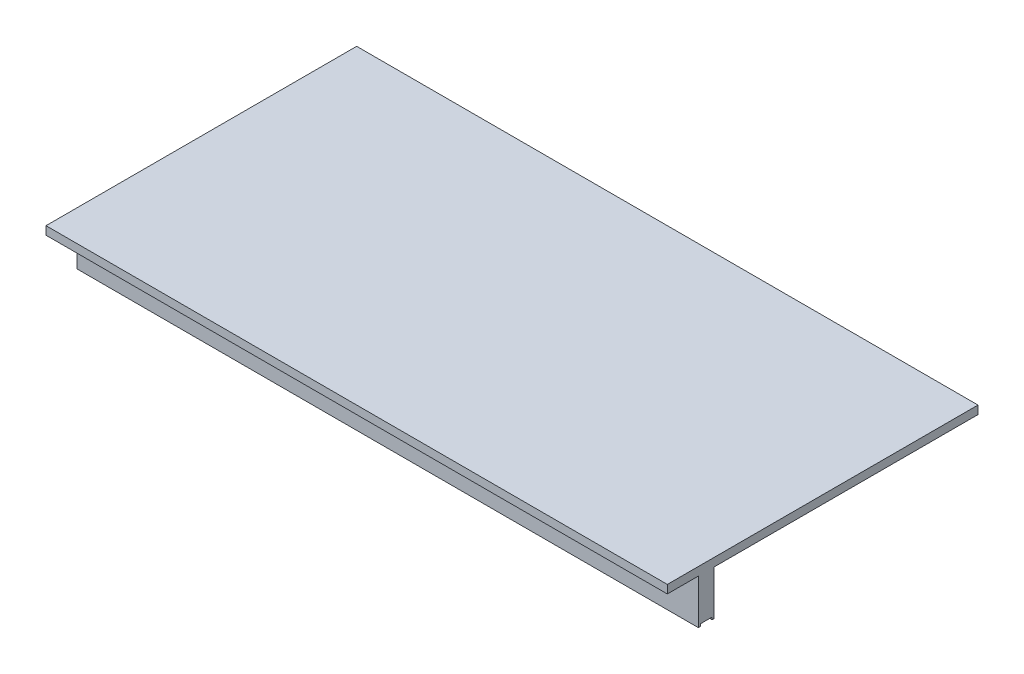
ISO-10303-21;
HEADER;
FILE_DESCRIPTION(('STEP AP214'),'2;1');
FILE_NAME('part.step','',(''),(''),'','','');
FILE_SCHEMA(('AUTOMOTIVE_DESIGN { 1 0 10303 214 1 1 1 1 }'));
ENDSEC;
DATA;
#1=APPLICATION_CONTEXT('core data for automotive mechanical design processes');
#2=APPLICATION_PROTOCOL_DEFINITION('international standard','automotive_design',2000,#1);
#3=PRODUCT_CONTEXT('',#1,'mechanical');
#4=PRODUCT('Part','Part','',(#3));
#5=PRODUCT_RELATED_PRODUCT_CATEGORY('part','',(#4));
#6=PRODUCT_DEFINITION_FORMATION('','',#4);
#7=PRODUCT_DEFINITION_CONTEXT('part definition',#1,'design');
#8=PRODUCT_DEFINITION('design','',#6,#7);
#9=PRODUCT_DEFINITION_SHAPE('','',#8);
#10=(LENGTH_UNIT() NAMED_UNIT(*) SI_UNIT(.MILLI.,.METRE.));
#11=(NAMED_UNIT(*) PLANE_ANGLE_UNIT() SI_UNIT($,.RADIAN.));
#12=(NAMED_UNIT(*) SI_UNIT($,.STERADIAN.) SOLID_ANGLE_UNIT());
#13=UNCERTAINTY_MEASURE_WITH_UNIT(LENGTH_MEASURE(1.E-05),#10,'distance_accuracy_value','');
#14=(GEOMETRIC_REPRESENTATION_CONTEXT(3) GLOBAL_UNCERTAINTY_ASSIGNED_CONTEXT((#13)) GLOBAL_UNIT_ASSIGNED_CONTEXT((#10,
#11,#12)) REPRESENTATION_CONTEXT('',''));
#15=CARTESIAN_POINT('',(0.,0.,0.));
#16=DIRECTION('',(0.,0.,1.));
#17=DIRECTION('',(1.,0.,0.));
#18=AXIS2_PLACEMENT_3D('',#15,#16,#17);
#19=CARTESIAN_POINT('',(1000.,-68.2290502793296,0.));
#20=DIRECTION('',(0.,1.,0.));
#21=DIRECTION('',(0.,0.,1.));
#22=AXIS2_PLACEMENT_3D('',#19,#20,#21);
#23=PLANE('',#22);
#24=DIRECTION('',(0.,0.,-1.));
#25=VECTOR('',#24,1.);
#26=CARTESIAN_POINT('',(0.,-68.2290502793296,0.));
#27=LINE('',#26,#25);
#28=CARTESIAN_POINT('',(0.,-68.2290502793296,-53.));
#29=VERTEX_POINT('',#28);
#30=CARTESIAN_POINT('',(0.,-68.2290502793296,-72.));
#31=VERTEX_POINT('',#30);
#32=EDGE_CURVE('E254',#29,#31,#27,.T.);
#33=ORIENTED_EDGE('',*,*,#32,.T.);
#34=DIRECTION('',(-1.,0.,0.));
#35=VECTOR('',#34,1.);
#36=CARTESIAN_POINT('',(1000.,-68.2290502793296,-72.));
#37=LINE('',#36,#35);
#38=CARTESIAN_POINT('',(1000.,-68.2290502793296,-72.));
#39=VERTEX_POINT('',#38);
#40=EDGE_CURVE('E189',#39,#31,#37,.T.);
#41=ORIENTED_EDGE('',*,*,#40,.F.);
#42=DIRECTION('',(0.,0.,-1.));
#43=VECTOR('',#42,1.);
#44=CARTESIAN_POINT('',(1000.,-68.2290502793296,0.));
#45=LINE('',#44,#43);
#46=CARTESIAN_POINT('',(1000.,-68.2290502793296,-53.));
#47=VERTEX_POINT('',#46);
#48=EDGE_CURVE('E235',#47,#39,#45,.T.);
#49=ORIENTED_EDGE('',*,*,#48,.F.);
#50=DIRECTION('',(-1.,0.,0.));
#51=VECTOR('',#50,1.);
#52=CARTESIAN_POINT('',(1000.,-68.2290502793296,-53.));
#53=LINE('',#52,#51);
#54=EDGE_CURVE('E185',#47,#29,#53,.T.);
#55=ORIENTED_EDGE('',*,*,#54,.T.);
#56=EDGE_LOOP('',(#33,#41,#49,#55));
#57=FACE_BOUND('',#56,.T.);
#58=ADVANCED_FACE('F107',(#57),#23,.F.);
#59=CARTESIAN_POINT('',(1000.,0.,0.));
#60=DIRECTION('',(0.,1.,0.));
#61=DIRECTION('',(0.,0.,1.));
#62=AXIS2_PLACEMENT_3D('',#59,#60,#61);
#63=PLANE('',#62);
#64=DIRECTION('',(0.,0.,-1.));
#65=VECTOR('',#64,1.);
#66=CARTESIAN_POINT('',(1000.,0.,0.));
#67=LINE('',#66,#65);
#68=CARTESIAN_POINT('',(1000.,0.,-75.));
#69=VERTEX_POINT('',#68);
#70=CARTESIAN_POINT('',(1000.,0.,-500.));
#71=VERTEX_POINT('',#70);
#72=EDGE_CURVE('E236',#69,#71,#67,.T.);
#73=ORIENTED_EDGE('',*,*,#72,.F.);
#74=DIRECTION('',(-1.,0.,0.));
#75=VECTOR('',#74,1.);
#76=CARTESIAN_POINT('',(1000.,0.,-75.));
#77=LINE('',#76,#75);
#78=CARTESIAN_POINT('',(0.,0.,-75.));
#79=VERTEX_POINT('',#78);
#80=EDGE_CURVE('E117',#69,#79,#77,.T.);
#81=ORIENTED_EDGE('',*,*,#80,.T.);
#82=DIRECTION('',(0.,0.,-1.));
#83=VECTOR('',#82,1.);
#84=CARTESIAN_POINT('',(0.,0.,0.));
#85=LINE('',#84,#83);
#86=CARTESIAN_POINT('',(0.,0.,-500.));
#87=VERTEX_POINT('',#86);
#88=EDGE_CURVE('E178',#79,#87,#85,.T.);
#89=ORIENTED_EDGE('',*,*,#88,.T.);
#90=DIRECTION('',(-1.,0.,0.));
#91=VECTOR('',#90,1.);
#92=CARTESIAN_POINT('',(1000.,0.,-500.));
#93=LINE('',#92,#91);
#94=EDGE_CURVE('E196',#71,#87,#93,.T.);
#95=ORIENTED_EDGE('',*,*,#94,.F.);
#96=EDGE_LOOP('',(#73,#81,#89,#95));
#97=FACE_BOUND('',#96,.T.);
#98=ADVANCED_FACE('F315',(#97),#63,.F.);
#99=CARTESIAN_POINT('',(1000.,0.,-500.));
#100=DIRECTION('',(0.,0.,1.));
#101=DIRECTION('',(1.,0.,0.));
#102=AXIS2_PLACEMENT_3D('',#99,#100,#101);
#103=PLANE('',#102);
#104=DIRECTION('',(0.,1.,0.));
#105=VECTOR('',#104,1.);
#106=CARTESIAN_POINT('',(0.,0.,-500.));
#107=LINE('',#106,#105);
#108=CARTESIAN_POINT('',(0.,13.3379888268156,-500.));
#109=VERTEX_POINT('',#108);
#110=EDGE_CURVE('E256',#87,#109,#107,.T.);
#111=ORIENTED_EDGE('',*,*,#110,.T.);
#112=DIRECTION('',(-1.,0.,0.));
#113=VECTOR('',#112,1.);
#114=CARTESIAN_POINT('',(1000.,13.3379888268156,-500.));
#115=LINE('',#114,#113);
#116=CARTESIAN_POINT('',(1000.,13.3379888268156,-500.));
#117=VERTEX_POINT('',#116);
#118=EDGE_CURVE('E269',#117,#109,#115,.T.);
#119=ORIENTED_EDGE('',*,*,#118,.F.);
#120=DIRECTION('',(0.,1.,0.));
#121=VECTOR('',#120,1.);
#122=CARTESIAN_POINT('',(1000.,0.,-500.));
#123=LINE('',#122,#121);
#124=EDGE_CURVE('E239',#71,#117,#123,.T.);
#125=ORIENTED_EDGE('',*,*,#124,.F.);
#126=ORIENTED_EDGE('',*,*,#94,.T.);
#127=EDGE_LOOP('',(#111,#119,#125,#126));
#128=FACE_BOUND('',#127,.T.);
#129=ADVANCED_FACE('F276',(#128),#103,.F.);
#130=CARTESIAN_POINT('',(1000.,13.3379888268156,0.));
#131=DIRECTION('',(0.,1.,0.));
#132=DIRECTION('',(0.,0.,1.));
#133=AXIS2_PLACEMENT_3D('',#130,#131,#132);
#134=PLANE('',#133);
#135=DIRECTION('',(0.,0.,-1.));
#136=VECTOR('',#135,1.);
#137=CARTESIAN_POINT('',(0.,13.3379888268156,0.));
#138=LINE('',#137,#136);
#139=CARTESIAN_POINT('',(0.,13.3379888268156,0.));
#140=VERTEX_POINT('',#139);
#141=EDGE_CURVE('E259',#140,#109,#138,.T.);
#142=ORIENTED_EDGE('',*,*,#141,.F.);
#143=DIRECTION('',(-1.,0.,0.));
#144=VECTOR('',#143,1.);
#145=CARTESIAN_POINT('',(1000.,13.3379888268156,0.));
#146=LINE('',#145,#144);
#147=CARTESIAN_POINT('',(1000.,13.3379888268156,0.));
#148=VERTEX_POINT('',#147);
#149=EDGE_CURVE('E266',#148,#140,#146,.T.);
#150=ORIENTED_EDGE('',*,*,#149,.F.);
#151=DIRECTION('',(0.,0.,-1.));
#152=VECTOR('',#151,1.);
#153=CARTESIAN_POINT('',(1000.,13.3379888268156,0.));
#154=LINE('',#153,#152);
#155=EDGE_CURVE('E245',#148,#117,#154,.T.);
#156=ORIENTED_EDGE('',*,*,#155,.T.);
#157=ORIENTED_EDGE('',*,*,#118,.T.);
#158=EDGE_LOOP('',(#142,#150,#156,#157));
#159=FACE_BOUND('',#158,.T.);
#160=ADVANCED_FACE('F286',(#159),#134,.T.);
#161=CARTESIAN_POINT('',(1000.,0.,0.));
#162=DIRECTION('',(0.,0.,1.));
#163=DIRECTION('',(1.,0.,0.));
#164=AXIS2_PLACEMENT_3D('',#161,#162,#163);
#165=PLANE('',#164);
#166=DIRECTION('',(0.,1.,0.));
#167=VECTOR('',#166,1.);
#168=CARTESIAN_POINT('',(0.,0.,0.));
#169=LINE('',#168,#167);
#170=CARTESIAN_POINT('',(0.,0.,0.));
#171=VERTEX_POINT('',#170);
#172=EDGE_CURVE('E241',#171,#140,#169,.T.);
#173=ORIENTED_EDGE('',*,*,#172,.F.);
#174=DIRECTION('',(-1.,0.,0.));
#175=VECTOR('',#174,1.);
#176=CARTESIAN_POINT('',(1000.,0.,0.));
#177=LINE('',#176,#175);
#178=CARTESIAN_POINT('',(1000.,0.,0.));
#179=VERTEX_POINT('',#178);
#180=EDGE_CURVE('E251',#179,#171,#177,.T.);
#181=ORIENTED_EDGE('',*,*,#180,.F.);
#182=DIRECTION('',(0.,1.,0.));
#183=VECTOR('',#182,1.);
#184=CARTESIAN_POINT('',(1000.,0.,0.));
#185=LINE('',#184,#183);
#186=EDGE_CURVE('E248',#179,#148,#185,.T.);
#187=ORIENTED_EDGE('',*,*,#186,.T.);
#188=ORIENTED_EDGE('',*,*,#149,.T.);
#189=EDGE_LOOP('',(#173,#181,#187,#188));
#190=FACE_BOUND('',#189,.T.);
#191=ADVANCED_FACE('F392',(#190),#165,.T.);
#192=DIRECTION('',(-1.,0.,0.));
#193=VECTOR('',#192,1.);
#194=CARTESIAN_POINT('',(1000.,0.,-50.));
#195=LINE('',#194,#193);
#196=CARTESIAN_POINT('',(1000.,0.,-50.));
#197=VERTEX_POINT('',#196);
#198=CARTESIAN_POINT('',(0.,0.,-50.));
#199=VERTEX_POINT('',#198);
#200=EDGE_CURVE('E12',#197,#199,#195,.T.);
#201=ORIENTED_EDGE('',*,*,#200,.F.);
#202=EDGE_CURVE('E237',#179,#197,#67,.T.);
#203=ORIENTED_EDGE('',*,*,#202,.F.);
#204=ORIENTED_EDGE('',*,*,#180,.T.);
#205=EDGE_CURVE('E218',#171,#199,#85,.T.);
#206=ORIENTED_EDGE('',*,*,#205,.T.);
#207=EDGE_LOOP('',(#201,#203,#204,#206));
#208=FACE_BOUND('',#207,.T.);
#209=ADVANCED_FACE('F321',(#208),#63,.F.);
#210=CARTESIAN_POINT('',(0.,0.,0.));
#211=DIRECTION('',(1.,0.,0.));
#212=DIRECTION('',(0.,0.,-1.));
#213=AXIS2_PLACEMENT_3D('',#210,#211,#212);
#214=PLANE('',#213);
#215=ORIENTED_EDGE('',*,*,#205,.F.);
#216=ORIENTED_EDGE('',*,*,#172,.T.);
#217=ORIENTED_EDGE('',*,*,#141,.T.);
#218=ORIENTED_EDGE('',*,*,#110,.F.);
#219=ORIENTED_EDGE('',*,*,#88,.F.);
#220=DIRECTION('',(0.,-1.,0.));
#221=VECTOR('',#220,1.);
#222=CARTESIAN_POINT('',(0.,0.,-75.));
#223=LINE('',#222,#221);
#224=CARTESIAN_POINT('',(0.,-72.,-75.));
#225=VERTEX_POINT('',#224);
#226=EDGE_CURVE('E164',#79,#225,#223,.T.);
#227=ORIENTED_EDGE('',*,*,#226,.T.);
#228=DIRECTION('',(0.,0.,-1.));
#229=VECTOR('',#228,1.);
#230=CARTESIAN_POINT('',(0.,-72.,-72.));
#231=LINE('',#230,#229);
#232=CARTESIAN_POINT('',(0.,-72.,-72.));
#233=VERTEX_POINT('',#232);
#234=EDGE_CURVE('E170',#233,#225,#231,.T.);
#235=ORIENTED_EDGE('',*,*,#234,.F.);
#236=DIRECTION('',(0.,-1.,0.));
#237=VECTOR('',#236,1.);
#238=CARTESIAN_POINT('',(0.,0.,-72.));
#239=LINE('',#238,#237);
#240=EDGE_CURVE('E156',#31,#233,#239,.T.);
#241=ORIENTED_EDGE('',*,*,#240,.F.);
#242=ORIENTED_EDGE('',*,*,#32,.F.);
#243=DIRECTION('',(0.,-1.,0.));
#244=VECTOR('',#243,1.);
#245=CARTESIAN_POINT('',(0.,0.,-53.));
#246=LINE('',#245,#244);
#247=CARTESIAN_POINT('',(0.,-72.,-53.));
#248=VERTEX_POINT('',#247);
#249=EDGE_CURVE('E209',#29,#248,#246,.T.);
#250=ORIENTED_EDGE('',*,*,#249,.T.);
#251=DIRECTION('',(0.,0.,-1.));
#252=VECTOR('',#251,1.);
#253=CARTESIAN_POINT('',(0.,-72.,-50.));
#254=LINE('',#253,#252);
#255=CARTESIAN_POINT('',(0.,-72.,-50.));
#256=VERTEX_POINT('',#255);
#257=EDGE_CURVE('E211',#256,#248,#254,.T.);
#258=ORIENTED_EDGE('',*,*,#257,.F.);
#259=DIRECTION('',(0.,-1.,0.));
#260=VECTOR('',#259,1.);
#261=CARTESIAN_POINT('',(0.,0.,-50.));
#262=LINE('',#261,#260);
#263=EDGE_CURVE('E203',#199,#256,#262,.T.);
#264=ORIENTED_EDGE('',*,*,#263,.F.);
#265=EDGE_LOOP('',(#215,#216,#217,#218,#219,#227,#235,#241,#242,#250,#258,#264));
#266=FACE_BOUND('',#265,.T.);
#267=ADVANCED_FACE('F175',(#266),#214,.F.);
#268=CARTESIAN_POINT('',(1000.,0.,0.));
#269=DIRECTION('',(1.,0.,0.));
#270=DIRECTION('',(0.,0.,-1.));
#271=AXIS2_PLACEMENT_3D('',#268,#269,#270);
#272=PLANE('',#271);
#273=ORIENTED_EDGE('',*,*,#202,.T.);
#274=DIRECTION('',(0.,-1.,0.));
#275=VECTOR('',#274,1.);
#276=CARTESIAN_POINT('',(1000.,0.,-50.));
#277=LINE('',#276,#275);
#278=CARTESIAN_POINT('',(1000.,-72.,-50.));
#279=VERTEX_POINT('',#278);
#280=EDGE_CURVE('E206',#197,#279,#277,.T.);
#281=ORIENTED_EDGE('',*,*,#280,.T.);
#282=DIRECTION('',(0.,0.,-1.));
#283=VECTOR('',#282,1.);
#284=CARTESIAN_POINT('',(1000.,-72.,-50.));
#285=LINE('',#284,#283);
#286=CARTESIAN_POINT('',(1000.,-72.,-53.));
#287=VERTEX_POINT('',#286);
#288=EDGE_CURVE('E202',#279,#287,#285,.T.);
#289=ORIENTED_EDGE('',*,*,#288,.T.);
#290=DIRECTION('',(0.,-1.,0.));
#291=VECTOR('',#290,1.);
#292=CARTESIAN_POINT('',(1000.,0.,-53.));
#293=LINE('',#292,#291);
#294=EDGE_CURVE('E200',#47,#287,#293,.T.);
#295=ORIENTED_EDGE('',*,*,#294,.F.);
#296=ORIENTED_EDGE('',*,*,#48,.T.);
#297=DIRECTION('',(0.,-1.,0.));
#298=VECTOR('',#297,1.);
#299=CARTESIAN_POINT('',(1000.,0.,-72.));
#300=LINE('',#299,#298);
#301=CARTESIAN_POINT('',(1000.,-72.,-72.));
#302=VERTEX_POINT('',#301);
#303=EDGE_CURVE('E179',#39,#302,#300,.T.);
#304=ORIENTED_EDGE('',*,*,#303,.T.);
#305=DIRECTION('',(0.,0.,-1.));
#306=VECTOR('',#305,1.);
#307=CARTESIAN_POINT('',(1000.,-72.,-72.));
#308=LINE('',#307,#306);
#309=CARTESIAN_POINT('',(1000.,-72.,-75.));
#310=VERTEX_POINT('',#309);
#311=EDGE_CURVE('E181',#302,#310,#308,.T.);
#312=ORIENTED_EDGE('',*,*,#311,.T.);
#313=DIRECTION('',(0.,-1.,0.));
#314=VECTOR('',#313,1.);
#315=CARTESIAN_POINT('',(1000.,0.,-75.));
#316=LINE('',#315,#314);
#317=EDGE_CURVE('E166',#69,#310,#316,.T.);
#318=ORIENTED_EDGE('',*,*,#317,.F.);
#319=ORIENTED_EDGE('',*,*,#72,.T.);
#320=ORIENTED_EDGE('',*,*,#124,.T.);
#321=ORIENTED_EDGE('',*,*,#155,.F.);
#322=ORIENTED_EDGE('',*,*,#186,.F.);
#323=EDGE_LOOP('',(#273,#281,#289,#295,#296,#304,#312,#318,#319,#320,#321,#322));
#324=FACE_BOUND('',#323,.T.);
#325=ADVANCED_FACE('F224',(#324),#272,.T.);
#326=CARTESIAN_POINT('',(1000.,0.,-72.));
#327=DIRECTION('',(0.,0.,-1.));
#328=DIRECTION('',(-1.,0.,0.));
#329=AXIS2_PLACEMENT_3D('',#326,#327,#328);
#330=PLANE('',#329);
#331=ORIENTED_EDGE('',*,*,#303,.F.);
#332=ORIENTED_EDGE('',*,*,#40,.T.);
#333=ORIENTED_EDGE('',*,*,#240,.T.);
#334=DIRECTION('',(-1.,0.,0.));
#335=VECTOR('',#334,1.);
#336=CARTESIAN_POINT('',(1000.,-72.,-72.));
#337=LINE('',#336,#335);
#338=EDGE_CURVE('E111',#302,#233,#337,.T.);
#339=ORIENTED_EDGE('',*,*,#338,.F.);
#340=EDGE_LOOP('',(#331,#332,#333,#339));
#341=FACE_BOUND('',#340,.T.);
#342=ADVANCED_FACE('F109',(#341),#330,.F.);
#343=CARTESIAN_POINT('',(1000.,-72.,-72.));
#344=DIRECTION('',(0.,1.,0.));
#345=DIRECTION('',(0.,0.,1.));
#346=AXIS2_PLACEMENT_3D('',#343,#344,#345);
#347=PLANE('',#346);
#348=ORIENTED_EDGE('',*,*,#234,.T.);
#349=DIRECTION('',(-1.,0.,0.));
#350=VECTOR('',#349,1.);
#351=CARTESIAN_POINT('',(1000.,-72.,-75.));
#352=LINE('',#351,#350);
#353=EDGE_CURVE('E160',#310,#225,#352,.T.);
#354=ORIENTED_EDGE('',*,*,#353,.F.);
#355=ORIENTED_EDGE('',*,*,#311,.F.);
#356=ORIENTED_EDGE('',*,*,#338,.T.);
#357=EDGE_LOOP('',(#348,#354,#355,#356));
#358=FACE_BOUND('',#357,.T.);
#359=ADVANCED_FACE('F171',(#358),#347,.F.);
#360=CARTESIAN_POINT('',(1000.,0.,-75.));
#361=DIRECTION('',(0.,0.,-1.));
#362=DIRECTION('',(-1.,0.,0.));
#363=AXIS2_PLACEMENT_3D('',#360,#361,#362);
#364=PLANE('',#363);
#365=ORIENTED_EDGE('',*,*,#226,.F.);
#366=ORIENTED_EDGE('',*,*,#80,.F.);
#367=ORIENTED_EDGE('',*,*,#317,.T.);
#368=ORIENTED_EDGE('',*,*,#353,.T.);
#369=EDGE_LOOP('',(#365,#366,#367,#368));
#370=FACE_BOUND('',#369,.T.);
#371=ADVANCED_FACE('F162',(#370),#364,.T.);
#372=CARTESIAN_POINT('',(1000.,0.,-50.));
#373=DIRECTION('',(0.,0.,-1.));
#374=DIRECTION('',(0.,1.,0.));
#375=AXIS2_PLACEMENT_3D('',#372,#373,#374);
#376=PLANE('',#375);
#377=ORIENTED_EDGE('',*,*,#263,.T.);
#378=DIRECTION('',(-1.,0.,0.));
#379=VECTOR('',#378,1.);
#380=CARTESIAN_POINT('',(1000.,-72.,-50.));
#381=LINE('',#380,#379);
#382=EDGE_CURVE('E215',#279,#256,#381,.T.);
#383=ORIENTED_EDGE('',*,*,#382,.F.);
#384=ORIENTED_EDGE('',*,*,#280,.F.);
#385=ORIENTED_EDGE('',*,*,#200,.T.);
#386=EDGE_LOOP('',(#377,#383,#384,#385));
#387=FACE_BOUND('',#386,.T.);
#388=ADVANCED_FACE('F324',(#387),#376,.F.);
#389=CARTESIAN_POINT('',(1000.,-72.,-50.));
#390=DIRECTION('',(0.,1.,0.));
#391=DIRECTION('',(0.,0.,1.));
#392=AXIS2_PLACEMENT_3D('',#389,#390,#391);
#393=PLANE('',#392);
#394=ORIENTED_EDGE('',*,*,#257,.T.);
#395=DIRECTION('',(-1.,0.,0.));
#396=VECTOR('',#395,1.);
#397=CARTESIAN_POINT('',(1000.,-72.,-53.));
#398=LINE('',#397,#396);
#399=EDGE_CURVE('E208',#287,#248,#398,.T.);
#400=ORIENTED_EDGE('',*,*,#399,.F.);
#401=ORIENTED_EDGE('',*,*,#288,.F.);
#402=ORIENTED_EDGE('',*,*,#382,.T.);
#403=EDGE_LOOP('',(#394,#400,#401,#402));
#404=FACE_BOUND('',#403,.T.);
#405=ADVANCED_FACE('F337',(#404),#393,.F.);
#406=CARTESIAN_POINT('',(1000.,0.,-53.));
#407=DIRECTION('',(0.,0.,-1.));
#408=DIRECTION('',(0.,1.,0.));
#409=AXIS2_PLACEMENT_3D('',#406,#407,#408);
#410=PLANE('',#409);
#411=ORIENTED_EDGE('',*,*,#54,.F.);
#412=ORIENTED_EDGE('',*,*,#294,.T.);
#413=ORIENTED_EDGE('',*,*,#399,.T.);
#414=ORIENTED_EDGE('',*,*,#249,.F.);
#415=EDGE_LOOP('',(#411,#412,#413,#414));
#416=FACE_BOUND('',#415,.T.);
#417=ADVANCED_FACE('F310',(#416),#410,.T.);
#418=CLOSED_SHELL('',(#58,#98,#129,#160,#191,#209,#267,#325,#342,#359,#371,#388,#405,#417));
#419=MANIFOLD_SOLID_BREP('B2',#418);
#420=ADVANCED_BREP_SHAPE_REPRESENTATION('',(#18,#419),#14);
#421=SHAPE_DEFINITION_REPRESENTATION(#9,#420);
ENDSEC;
END-ISO-10303-21;
